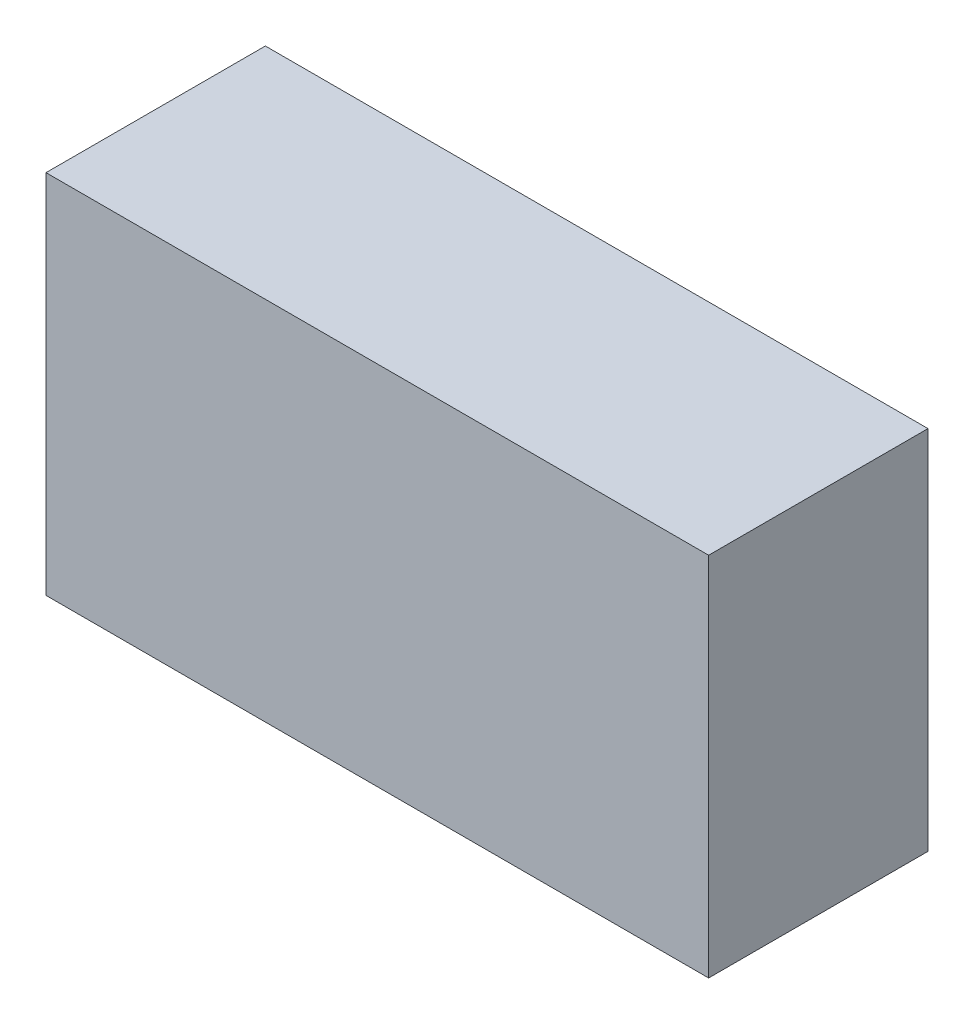
ISO-10303-21;
HEADER;
FILE_DESCRIPTION(('STEP AP214'),'2;1');
FILE_NAME('part.step','',(''),(''),'','','');
FILE_SCHEMA(('AUTOMOTIVE_DESIGN { 1 0 10303 214 1 1 1 1 }'));
ENDSEC;
DATA;
#1=APPLICATION_CONTEXT('core data for automotive mechanical design processes');
#2=APPLICATION_PROTOCOL_DEFINITION('international standard','automotive_design',2000,#1);
#3=PRODUCT_CONTEXT('',#1,'mechanical');
#4=PRODUCT('Part','Part','',(#3));
#5=PRODUCT_RELATED_PRODUCT_CATEGORY('part','',(#4));
#6=PRODUCT_DEFINITION_FORMATION('','',#4);
#7=PRODUCT_DEFINITION_CONTEXT('part definition',#1,'design');
#8=PRODUCT_DEFINITION('design','',#6,#7);
#9=PRODUCT_DEFINITION_SHAPE('','',#8);
#10=(LENGTH_UNIT() NAMED_UNIT(*) SI_UNIT(.MILLI.,.METRE.));
#11=(NAMED_UNIT(*) PLANE_ANGLE_UNIT() SI_UNIT($,.RADIAN.));
#12=(NAMED_UNIT(*) SI_UNIT($,.STERADIAN.) SOLID_ANGLE_UNIT());
#13=UNCERTAINTY_MEASURE_WITH_UNIT(LENGTH_MEASURE(1.E-05),#10,'distance_accuracy_value','');
#14=(GEOMETRIC_REPRESENTATION_CONTEXT(3) GLOBAL_UNCERTAINTY_ASSIGNED_CONTEXT((#13)) GLOBAL_UNIT_ASSIGNED_CONTEXT((#10,
#11,#12)) REPRESENTATION_CONTEXT('',''));
#15=CARTESIAN_POINT('',(0.,0.,0.));
#16=DIRECTION('',(0.,0.,1.));
#17=DIRECTION('',(1.,0.,0.));
#18=AXIS2_PLACEMENT_3D('',#15,#16,#17);
#19=CARTESIAN_POINT('',(-79.0368014902547,77.5714301256037,7.25));
#20=DIRECTION('',(1.,0.,0.));
#21=DIRECTION('',(0.,0.,-1.));
#22=AXIS2_PLACEMENT_3D('',#19,#20,#21);
#23=PLANE('',#22);
#24=DIRECTION('',(0.,-1.,0.));
#25=VECTOR('',#24,1.);
#26=CARTESIAN_POINT('',(-79.0368014902547,77.5714301256037,0.));
#27=LINE('',#26,#25);
#28=CARTESIAN_POINT('',(-79.0368014902547,77.5714301256037,0.));
#29=VERTEX_POINT('',#28);
#30=CARTESIAN_POINT('',(-79.0368014902547,65.47,0.));
#31=VERTEX_POINT('',#30);
#32=EDGE_CURVE('E128',#29,#31,#27,.T.);
#33=ORIENTED_EDGE('',*,*,#32,.T.);
#34=DIRECTION('',(0.,0.,-1.));
#35=VECTOR('',#34,1.);
#36=CARTESIAN_POINT('',(-79.0368014902547,65.47,7.25));
#37=LINE('',#36,#35);
#38=CARTESIAN_POINT('',(-79.0368014902547,65.47,7.25));
#39=VERTEX_POINT('',#38);
#40=EDGE_CURVE('E11',#39,#31,#37,.T.);
#41=ORIENTED_EDGE('',*,*,#40,.F.);
#42=DIRECTION('',(0.,-1.,0.));
#43=VECTOR('',#42,1.);
#44=CARTESIAN_POINT('',(-79.0368014902547,77.5714301256037,7.25));
#45=LINE('',#44,#43);
#46=CARTESIAN_POINT('',(-79.0368014902547,77.5714301256037,7.25));
#47=VERTEX_POINT('',#46);
#48=EDGE_CURVE('E148',#47,#39,#45,.T.);
#49=ORIENTED_EDGE('',*,*,#48,.F.);
#50=DIRECTION('',(0.,0.,-1.));
#51=VECTOR('',#50,1.);
#52=CARTESIAN_POINT('',(-79.0368014902547,77.5714301256037,7.25));
#53=LINE('',#52,#51);
#54=EDGE_CURVE('E153',#47,#29,#53,.T.);
#55=ORIENTED_EDGE('',*,*,#54,.T.);
#56=EDGE_LOOP('',(#33,#41,#49,#55));
#57=FACE_BOUND('',#56,.T.);
#58=ADVANCED_FACE('F32',(#57),#23,.F.);
#59=CARTESIAN_POINT('',(-79.0368014902547,65.47,7.25));
#60=DIRECTION('',(0.,1.,0.));
#61=DIRECTION('',(0.,0.,1.));
#62=AXIS2_PLACEMENT_3D('',#59,#60,#61);
#63=PLANE('',#62);
#64=DIRECTION('',(1.,0.,0.));
#65=VECTOR('',#64,1.);
#66=CARTESIAN_POINT('',(-79.0368014902547,65.47,0.));
#67=LINE('',#66,#65);
#68=CARTESIAN_POINT('',(-57.1355,65.47,0.));
#69=VERTEX_POINT('',#68);
#70=EDGE_CURVE('E132',#31,#69,#67,.T.);
#71=ORIENTED_EDGE('',*,*,#70,.T.);
#72=DIRECTION('',(0.,0.,-1.));
#73=VECTOR('',#72,1.);
#74=CARTESIAN_POINT('',(-57.1355,65.47,7.25));
#75=LINE('',#74,#73);
#76=CARTESIAN_POINT('',(-57.1355,65.47,7.25));
#77=VERTEX_POINT('',#76);
#78=EDGE_CURVE('E39',#77,#69,#75,.T.);
#79=ORIENTED_EDGE('',*,*,#78,.F.);
#80=DIRECTION('',(1.,0.,0.));
#81=VECTOR('',#80,1.);
#82=CARTESIAN_POINT('',(-79.0368014902547,65.47,7.25));
#83=LINE('',#82,#81);
#84=EDGE_CURVE('E83',#39,#77,#83,.T.);
#85=ORIENTED_EDGE('',*,*,#84,.F.);
#86=ORIENTED_EDGE('',*,*,#40,.T.);
#87=EDGE_LOOP('',(#71,#79,#85,#86));
#88=FACE_BOUND('',#87,.T.);
#89=ADVANCED_FACE('F182',(#88),#63,.F.);
#90=CARTESIAN_POINT('',(-57.1355,77.5714301256037,7.25));
#91=DIRECTION('',(-1.,0.,0.));
#92=DIRECTION('',(0.,0.,1.));
#93=AXIS2_PLACEMENT_3D('',#90,#91,#92);
#94=PLANE('',#93);
#95=DIRECTION('',(0.,1.,0.));
#96=VECTOR('',#95,1.);
#97=CARTESIAN_POINT('',(-57.1355,77.5714301256037,0.));
#98=LINE('',#97,#96);
#99=CARTESIAN_POINT('',(-57.1355,77.5714301256037,0.));
#100=VERTEX_POINT('',#99);
#101=EDGE_CURVE('E156',#69,#100,#98,.T.);
#102=ORIENTED_EDGE('',*,*,#101,.T.);
#103=DIRECTION('',(0.,0.,-1.));
#104=VECTOR('',#103,1.);
#105=CARTESIAN_POINT('',(-57.1355,77.5714301256037,7.25));
#106=LINE('',#105,#104);
#107=CARTESIAN_POINT('',(-57.1355,77.5714301256037,7.25));
#108=VERTEX_POINT('',#107);
#109=EDGE_CURVE('E160',#108,#100,#106,.T.);
#110=ORIENTED_EDGE('',*,*,#109,.F.);
#111=DIRECTION('',(0.,1.,0.));
#112=VECTOR('',#111,1.);
#113=CARTESIAN_POINT('',(-57.1355,77.5714301256037,7.25));
#114=LINE('',#113,#112);
#115=EDGE_CURVE('E151',#77,#108,#114,.T.);
#116=ORIENTED_EDGE('',*,*,#115,.F.);
#117=ORIENTED_EDGE('',*,*,#78,.T.);
#118=EDGE_LOOP('',(#102,#110,#116,#117));
#119=FACE_BOUND('',#118,.T.);
#120=ADVANCED_FACE('F165',(#119),#94,.F.);
#121=CARTESIAN_POINT('',(-79.0368014902547,77.5714301256037,7.25));
#122=DIRECTION('',(0.,-1.,0.));
#123=DIRECTION('',(0.,0.,-1.));
#124=AXIS2_PLACEMENT_3D('',#121,#122,#123);
#125=PLANE('',#124);
#126=DIRECTION('',(-1.,0.,0.));
#127=VECTOR('',#126,1.);
#128=CARTESIAN_POINT('',(-79.0368014902547,77.5714301256037,0.));
#129=LINE('',#128,#127);
#130=EDGE_CURVE('E76',#100,#29,#129,.T.);
#131=ORIENTED_EDGE('',*,*,#130,.T.);
#132=ORIENTED_EDGE('',*,*,#54,.F.);
#133=DIRECTION('',(-1.,0.,0.));
#134=VECTOR('',#133,1.);
#135=CARTESIAN_POINT('',(-79.0368014902547,77.5714301256037,7.25));
#136=LINE('',#135,#134);
#137=EDGE_CURVE('E55',#108,#47,#136,.T.);
#138=ORIENTED_EDGE('',*,*,#137,.F.);
#139=ORIENTED_EDGE('',*,*,#109,.T.);
#140=EDGE_LOOP('',(#131,#132,#138,#139));
#141=FACE_BOUND('',#140,.T.);
#142=ADVANCED_FACE('F173',(#141),#125,.F.);
#143=CARTESIAN_POINT('',(0.,0.,7.25));
#144=DIRECTION('',(0.,0.,1.));
#145=DIRECTION('',(1.,0.,0.));
#146=AXIS2_PLACEMENT_3D('',#143,#144,#145);
#147=PLANE('',#146);
#148=ORIENTED_EDGE('',*,*,#48,.T.);
#149=ORIENTED_EDGE('',*,*,#84,.T.);
#150=ORIENTED_EDGE('',*,*,#115,.T.);
#151=ORIENTED_EDGE('',*,*,#137,.T.);
#152=EDGE_LOOP('',(#148,#149,#150,#151));
#153=FACE_BOUND('',#152,.T.);
#154=ADVANCED_FACE('F175',(#153),#147,.T.);
#155=CARTESIAN_POINT('',(0.,0.,0.));
#156=DIRECTION('',(0.,0.,1.));
#157=DIRECTION('',(1.,0.,0.));
#158=AXIS2_PLACEMENT_3D('',#155,#156,#157);
#159=PLANE('',#158);
#160=DIRECTION('',(-1.,0.,0.));
#161=VECTOR('',#160,1.);
#162=CARTESIAN_POINT('',(-79.0368014902547,77.0714301256037,0.));
#163=LINE('',#162,#161);
#164=CARTESIAN_POINT('',(-57.6355,77.0714301256037,0.));
#165=VERTEX_POINT('',#164);
#166=CARTESIAN_POINT('',(-78.5368014902547,77.0714301256037,0.));
#167=VERTEX_POINT('',#166);
#168=EDGE_CURVE('E123',#165,#167,#163,.T.);
#169=ORIENTED_EDGE('',*,*,#168,.T.);
#170=DIRECTION('',(0.,-1.,0.));
#171=VECTOR('',#170,1.);
#172=CARTESIAN_POINT('',(-78.5368014902547,77.5714301256037,0.));
#173=LINE('',#172,#171);
#174=CARTESIAN_POINT('',(-78.5368014902547,65.97,0.));
#175=VERTEX_POINT('',#174);
#176=EDGE_CURVE('E142',#167,#175,#173,.T.);
#177=ORIENTED_EDGE('',*,*,#176,.T.);
#178=DIRECTION('',(1.,0.,0.));
#179=VECTOR('',#178,1.);
#180=CARTESIAN_POINT('',(-79.0368014902547,65.97,0.));
#181=LINE('',#180,#179);
#182=CARTESIAN_POINT('',(-57.6355,65.97,0.));
#183=VERTEX_POINT('',#182);
#184=EDGE_CURVE('E127',#175,#183,#181,.T.);
#185=ORIENTED_EDGE('',*,*,#184,.T.);
#186=DIRECTION('',(0.,1.,0.));
#187=VECTOR('',#186,1.);
#188=CARTESIAN_POINT('',(-57.6355,77.5714301256037,0.));
#189=LINE('',#188,#187);
#190=EDGE_CURVE('E46',#183,#165,#189,.T.);
#191=ORIENTED_EDGE('',*,*,#190,.T.);
#192=EDGE_LOOP('',(#169,#177,#185,#191));
#193=FACE_BOUND('',#192,.T.);
#194=ORIENTED_EDGE('',*,*,#32,.F.);
#195=ORIENTED_EDGE('',*,*,#130,.F.);
#196=ORIENTED_EDGE('',*,*,#101,.F.);
#197=ORIENTED_EDGE('',*,*,#70,.F.);
#198=EDGE_LOOP('',(#194,#195,#196,#197));
#199=FACE_BOUND('',#198,.T.);
#200=ADVANCED_FACE('F169',(#193,#199),#159,.F.);
#201=CARTESIAN_POINT('',(-78.5368014902547,77.5714301256037,7.25));
#202=DIRECTION('',(1.,0.,0.));
#203=DIRECTION('',(0.,0.,-1.));
#204=AXIS2_PLACEMENT_3D('',#201,#202,#203);
#205=PLANE('',#204);
#206=ORIENTED_EDGE('',*,*,#176,.F.);
#207=DIRECTION('',(0.,0.,-1.));
#208=VECTOR('',#207,1.);
#209=CARTESIAN_POINT('',(-78.5368014902547,77.0714301256037,7.25));
#210=LINE('',#209,#208);
#211=CARTESIAN_POINT('',(-78.5368014902547,77.0714301256037,7.05));
#212=VERTEX_POINT('',#211);
#213=EDGE_CURVE('E122',#212,#167,#210,.T.);
#214=ORIENTED_EDGE('',*,*,#213,.F.);
#215=DIRECTION('',(0.,-1.,0.));
#216=VECTOR('',#215,1.);
#217=CARTESIAN_POINT('',(-78.5368014902547,77.5714301256037,7.05));
#218=LINE('',#217,#216);
#219=CARTESIAN_POINT('',(-78.5368014902547,65.97,7.05));
#220=VERTEX_POINT('',#219);
#221=EDGE_CURVE('E110',#212,#220,#218,.T.);
#222=ORIENTED_EDGE('',*,*,#221,.T.);
#223=DIRECTION('',(0.,0.,-1.));
#224=VECTOR('',#223,1.);
#225=CARTESIAN_POINT('',(-78.5368014902547,65.97,7.25));
#226=LINE('',#225,#224);
#227=EDGE_CURVE('E120',#220,#175,#226,.T.);
#228=ORIENTED_EDGE('',*,*,#227,.T.);
#229=EDGE_LOOP('',(#206,#214,#222,#228));
#230=FACE_BOUND('',#229,.T.);
#231=ADVANCED_FACE('F119',(#230),#205,.T.);
#232=CARTESIAN_POINT('',(-79.0368014902547,65.97,7.25));
#233=DIRECTION('',(0.,1.,0.));
#234=DIRECTION('',(0.,0.,1.));
#235=AXIS2_PLACEMENT_3D('',#232,#233,#234);
#236=PLANE('',#235);
#237=ORIENTED_EDGE('',*,*,#184,.F.);
#238=ORIENTED_EDGE('',*,*,#227,.F.);
#239=DIRECTION('',(1.,0.,0.));
#240=VECTOR('',#239,1.);
#241=CARTESIAN_POINT('',(-79.0368014902547,65.97,7.05));
#242=LINE('',#241,#240);
#243=CARTESIAN_POINT('',(-57.6355,65.97,7.05));
#244=VERTEX_POINT('',#243);
#245=EDGE_CURVE('E106',#220,#244,#242,.T.);
#246=ORIENTED_EDGE('',*,*,#245,.T.);
#247=DIRECTION('',(0.,0.,-1.));
#248=VECTOR('',#247,1.);
#249=CARTESIAN_POINT('',(-57.6355,65.97,7.25));
#250=LINE('',#249,#248);
#251=EDGE_CURVE('E129',#244,#183,#250,.T.);
#252=ORIENTED_EDGE('',*,*,#251,.T.);
#253=EDGE_LOOP('',(#237,#238,#246,#252));
#254=FACE_BOUND('',#253,.T.);
#255=ADVANCED_FACE('F125',(#254),#236,.T.);
#256=CARTESIAN_POINT('',(-57.6355,77.5714301256037,7.25));
#257=DIRECTION('',(-1.,0.,0.));
#258=DIRECTION('',(0.,0.,1.));
#259=AXIS2_PLACEMENT_3D('',#256,#257,#258);
#260=PLANE('',#259);
#261=ORIENTED_EDGE('',*,*,#190,.F.);
#262=ORIENTED_EDGE('',*,*,#251,.F.);
#263=DIRECTION('',(0.,1.,0.));
#264=VECTOR('',#263,1.);
#265=CARTESIAN_POINT('',(-57.6355,77.5714301256037,7.05));
#266=LINE('',#265,#264);
#267=CARTESIAN_POINT('',(-57.6355,77.0714301256037,7.05));
#268=VERTEX_POINT('',#267);
#269=EDGE_CURVE('E111',#244,#268,#266,.T.);
#270=ORIENTED_EDGE('',*,*,#269,.T.);
#271=DIRECTION('',(0.,0.,-1.));
#272=VECTOR('',#271,1.);
#273=CARTESIAN_POINT('',(-57.6355,77.0714301256037,7.25));
#274=LINE('',#273,#272);
#275=EDGE_CURVE('E134',#268,#165,#274,.T.);
#276=ORIENTED_EDGE('',*,*,#275,.T.);
#277=EDGE_LOOP('',(#261,#262,#270,#276));
#278=FACE_BOUND('',#277,.T.);
#279=ADVANCED_FACE('F230',(#278),#260,.T.);
#280=CARTESIAN_POINT('',(-79.0368014902547,77.0714301256037,7.25));
#281=DIRECTION('',(0.,-1.,0.));
#282=DIRECTION('',(0.,0.,-1.));
#283=AXIS2_PLACEMENT_3D('',#280,#281,#282);
#284=PLANE('',#283);
#285=ORIENTED_EDGE('',*,*,#168,.F.);
#286=ORIENTED_EDGE('',*,*,#275,.F.);
#287=DIRECTION('',(-1.,0.,0.));
#288=VECTOR('',#287,1.);
#289=CARTESIAN_POINT('',(-79.0368014902547,77.0714301256037,7.05));
#290=LINE('',#289,#288);
#291=EDGE_CURVE('E137',#268,#212,#290,.T.);
#292=ORIENTED_EDGE('',*,*,#291,.T.);
#293=ORIENTED_EDGE('',*,*,#213,.T.);
#294=EDGE_LOOP('',(#285,#286,#292,#293));
#295=FACE_BOUND('',#294,.T.);
#296=ADVANCED_FACE('F239',(#295),#284,.T.);
#297=CARTESIAN_POINT('',(0.,0.,7.05));
#298=DIRECTION('',(0.,0.,1.));
#299=DIRECTION('',(1.,0.,0.));
#300=AXIS2_PLACEMENT_3D('',#297,#298,#299);
#301=PLANE('',#300);
#302=ORIENTED_EDGE('',*,*,#221,.F.);
#303=ORIENTED_EDGE('',*,*,#291,.F.);
#304=ORIENTED_EDGE('',*,*,#269,.F.);
#305=ORIENTED_EDGE('',*,*,#245,.F.);
#306=EDGE_LOOP('',(#302,#303,#304,#305));
#307=FACE_BOUND('',#306,.T.);
#308=ADVANCED_FACE('F108',(#307),#301,.F.);
#309=CLOSED_SHELL('',(#58,#89,#120,#142,#154,#200,#231,#255,#279,#296,#308));
#310=MANIFOLD_SOLID_BREP('B2',#309);
#311=ADVANCED_BREP_SHAPE_REPRESENTATION('',(#18,#310),#14);
#312=SHAPE_DEFINITION_REPRESENTATION(#9,#311);
ENDSEC;
END-ISO-10303-21;
